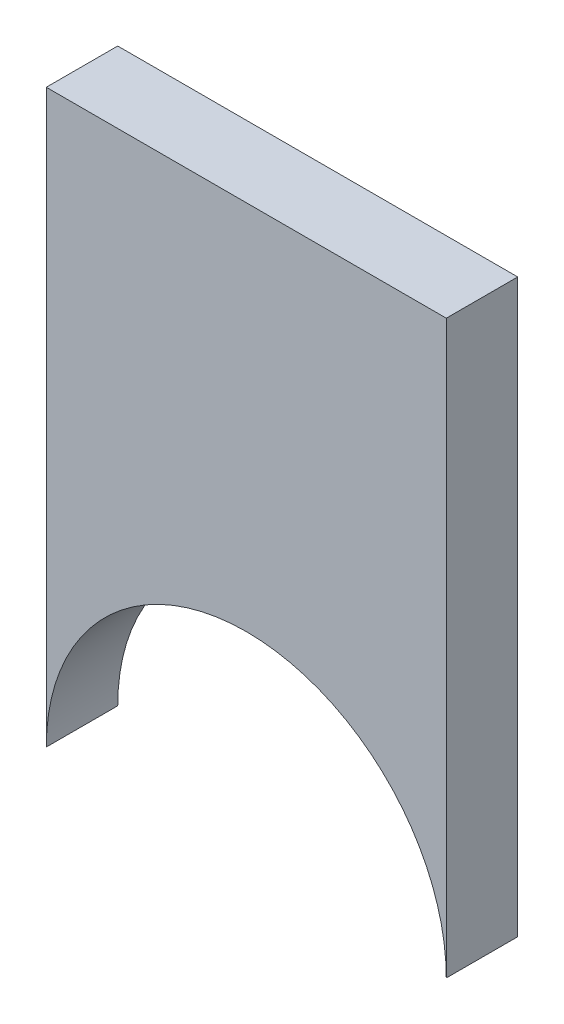
ISO-10303-21;
HEADER;
FILE_DESCRIPTION(('STEP AP214'),'2;1');
FILE_NAME('part.step','',(''),(''),'','','');
FILE_SCHEMA(('AUTOMOTIVE_DESIGN { 1 0 10303 214 1 1 1 1 }'));
ENDSEC;
DATA;
#1=APPLICATION_CONTEXT('core data for automotive mechanical design processes');
#2=APPLICATION_PROTOCOL_DEFINITION('international standard','automotive_design',2000,#1);
#3=PRODUCT_CONTEXT('',#1,'mechanical');
#4=PRODUCT('Part','Part','',(#3));
#5=PRODUCT_RELATED_PRODUCT_CATEGORY('part','',(#4));
#6=PRODUCT_DEFINITION_FORMATION('','',#4);
#7=PRODUCT_DEFINITION_CONTEXT('part definition',#1,'design');
#8=PRODUCT_DEFINITION('design','',#6,#7);
#9=PRODUCT_DEFINITION_SHAPE('','',#8);
#10=(LENGTH_UNIT() NAMED_UNIT(*) SI_UNIT(.MILLI.,.METRE.));
#11=(NAMED_UNIT(*) PLANE_ANGLE_UNIT() SI_UNIT($,.RADIAN.));
#12=(NAMED_UNIT(*) SI_UNIT($,.STERADIAN.) SOLID_ANGLE_UNIT());
#13=UNCERTAINTY_MEASURE_WITH_UNIT(LENGTH_MEASURE(1.E-05),#10,'distance_accuracy_value','');
#14=(GEOMETRIC_REPRESENTATION_CONTEXT(3) GLOBAL_UNCERTAINTY_ASSIGNED_CONTEXT((#13)) GLOBAL_UNIT_ASSIGNED_CONTEXT((#10,
#11,#12)) REPRESENTATION_CONTEXT('',''));
#15=CARTESIAN_POINT('',(0.,0.,0.));
#16=DIRECTION('',(0.,0.,1.));
#17=DIRECTION('',(1.,0.,0.));
#18=AXIS2_PLACEMENT_3D('',#15,#16,#17);
#19=CARTESIAN_POINT('',(0.,0.,20.));
#20=DIRECTION('',(0.,0.,-1.));
#21=DIRECTION('',(-1.,0.,0.));
#22=AXIS2_PLACEMENT_3D('',#19,#20,#21);
#23=CYLINDRICAL_SURFACE('',#22,56.);
#24=CARTESIAN_POINT('',(0.,0.,0.));
#25=DIRECTION('',(0.,0.,-1.));
#26=DIRECTION('',(1.,0.,0.));
#27=AXIS2_PLACEMENT_3D('',#24,#25,#26);
#28=CIRCLE('',#27,56.);
#29=CARTESIAN_POINT('',(-56.,0.,0.));
#30=VERTEX_POINT('',#29);
#31=CARTESIAN_POINT('',(56.,0.,0.));
#32=VERTEX_POINT('',#31);
#33=EDGE_CURVE('E102',#30,#32,#28,.T.);
#34=ORIENTED_EDGE('',*,*,#33,.T.);
#35=DIRECTION('',(0.,0.,-1.));
#36=VECTOR('',#35,1.);
#37=CARTESIAN_POINT('',(56.,0.,20.));
#38=LINE('',#37,#36);
#39=CARTESIAN_POINT('',(56.,0.,20.));
#40=VERTEX_POINT('',#39);
#41=EDGE_CURVE('E11',#40,#32,#38,.T.);
#42=ORIENTED_EDGE('',*,*,#41,.F.);
#43=CARTESIAN_POINT('',(0.,0.,20.));
#44=DIRECTION('',(0.,0.,-1.));
#45=DIRECTION('',(1.,0.,0.));
#46=AXIS2_PLACEMENT_3D('',#43,#44,#45);
#47=CIRCLE('',#46,56.);
#48=CARTESIAN_POINT('',(-56.,0.,20.));
#49=VERTEX_POINT('',#48);
#50=EDGE_CURVE('E90',#49,#40,#47,.T.);
#51=ORIENTED_EDGE('',*,*,#50,.F.);
#52=DIRECTION('',(0.,0.,-1.));
#53=VECTOR('',#52,1.);
#54=CARTESIAN_POINT('',(-56.,0.,20.));
#55=LINE('',#54,#53);
#56=EDGE_CURVE('E98',#49,#30,#55,.T.);
#57=ORIENTED_EDGE('',*,*,#56,.T.);
#58=EDGE_LOOP('',(#34,#42,#51,#57));
#59=FACE_BOUND('',#58,.T.);
#60=ADVANCED_FACE('F39',(#59),#23,.F.);
#61=CARTESIAN_POINT('',(56.,0.,20.));
#62=DIRECTION('',(-1.,0.,0.));
#63=DIRECTION('',(0.,0.,1.));
#64=AXIS2_PLACEMENT_3D('',#61,#62,#63);
#65=PLANE('',#64);
#66=DIRECTION('',(0.,1.,0.));
#67=VECTOR('',#66,1.);
#68=CARTESIAN_POINT('',(56.,0.,0.));
#69=LINE('',#68,#67);
#70=CARTESIAN_POINT('',(56.,160.,0.));
#71=VERTEX_POINT('',#70);
#72=EDGE_CURVE('E94',#32,#71,#69,.T.);
#73=ORIENTED_EDGE('',*,*,#72,.T.);
#74=DIRECTION('',(0.,0.,-1.));
#75=VECTOR('',#74,1.);
#76=CARTESIAN_POINT('',(56.,160.,20.));
#77=LINE('',#76,#75);
#78=CARTESIAN_POINT('',(56.,160.,20.));
#79=VERTEX_POINT('',#78);
#80=EDGE_CURVE('E47',#79,#71,#77,.T.);
#81=ORIENTED_EDGE('',*,*,#80,.F.);
#82=DIRECTION('',(0.,1.,0.));
#83=VECTOR('',#82,1.);
#84=CARTESIAN_POINT('',(56.,0.,20.));
#85=LINE('',#84,#83);
#86=EDGE_CURVE('E85',#40,#79,#85,.T.);
#87=ORIENTED_EDGE('',*,*,#86,.F.);
#88=ORIENTED_EDGE('',*,*,#41,.T.);
#89=EDGE_LOOP('',(#73,#81,#87,#88));
#90=FACE_BOUND('',#89,.T.);
#91=ADVANCED_FACE('F93',(#90),#65,.F.);
#92=CARTESIAN_POINT('',(-56.,160.,20.));
#93=DIRECTION('',(0.,-1.,0.));
#94=DIRECTION('',(0.,0.,-1.));
#95=AXIS2_PLACEMENT_3D('',#92,#93,#94);
#96=PLANE('',#95);
#97=DIRECTION('',(-1.,0.,0.));
#98=VECTOR('',#97,1.);
#99=CARTESIAN_POINT('',(-56.,160.,0.));
#100=LINE('',#99,#98);
#101=CARTESIAN_POINT('',(-56.,160.,0.));
#102=VERTEX_POINT('',#101);
#103=EDGE_CURVE('E72',#71,#102,#100,.T.);
#104=ORIENTED_EDGE('',*,*,#103,.T.);
#105=DIRECTION('',(0.,0.,-1.));
#106=VECTOR('',#105,1.);
#107=CARTESIAN_POINT('',(-56.,160.,20.));
#108=LINE('',#107,#106);
#109=CARTESIAN_POINT('',(-56.,160.,20.));
#110=VERTEX_POINT('',#109);
#111=EDGE_CURVE('E95',#110,#102,#108,.T.);
#112=ORIENTED_EDGE('',*,*,#111,.F.);
#113=DIRECTION('',(-1.,0.,0.));
#114=VECTOR('',#113,1.);
#115=CARTESIAN_POINT('',(-56.,160.,20.));
#116=LINE('',#115,#114);
#117=EDGE_CURVE('E88',#79,#110,#116,.T.);
#118=ORIENTED_EDGE('',*,*,#117,.F.);
#119=ORIENTED_EDGE('',*,*,#80,.T.);
#120=EDGE_LOOP('',(#104,#112,#118,#119));
#121=FACE_BOUND('',#120,.T.);
#122=ADVANCED_FACE('F96',(#121),#96,.F.);
#123=CARTESIAN_POINT('',(-56.,0.,20.));
#124=DIRECTION('',(1.,0.,0.));
#125=DIRECTION('',(0.,0.,-1.));
#126=AXIS2_PLACEMENT_3D('',#123,#124,#125);
#127=PLANE('',#126);
#128=DIRECTION('',(0.,-1.,0.));
#129=VECTOR('',#128,1.);
#130=CARTESIAN_POINT('',(-56.,0.,0.));
#131=LINE('',#130,#129);
#132=EDGE_CURVE('E78',#102,#30,#131,.T.);
#133=ORIENTED_EDGE('',*,*,#132,.T.);
#134=ORIENTED_EDGE('',*,*,#56,.F.);
#135=DIRECTION('',(0.,-1.,0.));
#136=VECTOR('',#135,1.);
#137=CARTESIAN_POINT('',(-56.,0.,20.));
#138=LINE('',#137,#136);
#139=EDGE_CURVE('E55',#110,#49,#138,.T.);
#140=ORIENTED_EDGE('',*,*,#139,.F.);
#141=ORIENTED_EDGE('',*,*,#111,.T.);
#142=EDGE_LOOP('',(#133,#134,#140,#141));
#143=FACE_BOUND('',#142,.T.);
#144=ADVANCED_FACE('F109',(#143),#127,.F.);
#145=CARTESIAN_POINT('',(0.,0.,20.));
#146=DIRECTION('',(0.,0.,1.));
#147=DIRECTION('',(1.,0.,0.));
#148=AXIS2_PLACEMENT_3D('',#145,#146,#147);
#149=PLANE('',#148);
#150=ORIENTED_EDGE('',*,*,#50,.T.);
#151=ORIENTED_EDGE('',*,*,#86,.T.);
#152=ORIENTED_EDGE('',*,*,#117,.T.);
#153=ORIENTED_EDGE('',*,*,#139,.T.);
#154=EDGE_LOOP('',(#150,#151,#152,#153));
#155=FACE_BOUND('',#154,.T.);
#156=ADVANCED_FACE('F86',(#155),#149,.T.);
#157=CARTESIAN_POINT('',(0.,0.,0.));
#158=DIRECTION('',(0.,0.,1.));
#159=DIRECTION('',(1.,0.,0.));
#160=AXIS2_PLACEMENT_3D('',#157,#158,#159);
#161=PLANE('',#160);
#162=ORIENTED_EDGE('',*,*,#33,.F.);
#163=ORIENTED_EDGE('',*,*,#132,.F.);
#164=ORIENTED_EDGE('',*,*,#103,.F.);
#165=ORIENTED_EDGE('',*,*,#72,.F.);
#166=EDGE_LOOP('',(#162,#163,#164,#165));
#167=FACE_BOUND('',#166,.T.);
#168=ADVANCED_FACE('F112',(#167),#161,.F.);
#169=CLOSED_SHELL('',(#60,#91,#122,#144,#156,#168));
#170=MANIFOLD_SOLID_BREP('B2',#169);
#171=ADVANCED_BREP_SHAPE_REPRESENTATION('',(#18,#170),#14);
#172=SHAPE_DEFINITION_REPRESENTATION(#9,#171);
ENDSEC;
END-ISO-10303-21;
